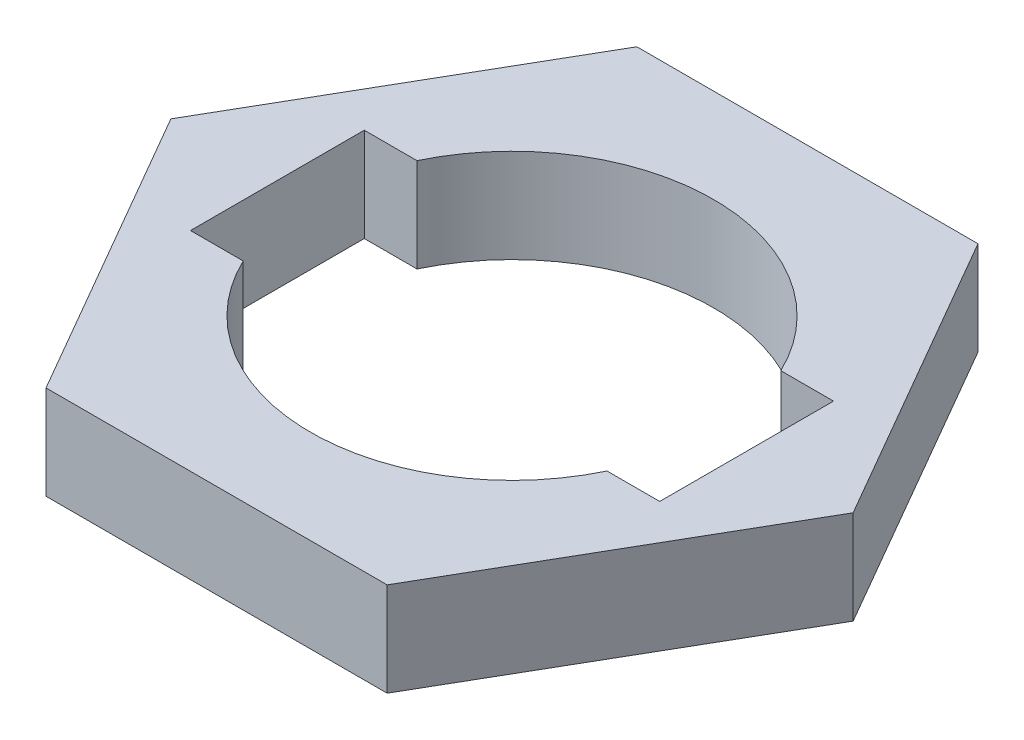
ISO-10303-21;
HEADER;
FILE_DESCRIPTION(('STEP AP214'),'2;1');
FILE_NAME('part.step','',(''),(''),'','','');
FILE_SCHEMA(('AUTOMOTIVE_DESIGN { 1 0 10303 214 1 1 1 1 }'));
ENDSEC;
DATA;
#1=APPLICATION_CONTEXT('core data for automotive mechanical design processes');
#2=APPLICATION_PROTOCOL_DEFINITION('international standard','automotive_design',2000,#1);
#3=PRODUCT_CONTEXT('',#1,'mechanical');
#4=PRODUCT('Part','Part','',(#3));
#5=PRODUCT_RELATED_PRODUCT_CATEGORY('part','',(#4));
#6=PRODUCT_DEFINITION_FORMATION('','',#4);
#7=PRODUCT_DEFINITION_CONTEXT('part definition',#1,'design');
#8=PRODUCT_DEFINITION('design','',#6,#7);
#9=PRODUCT_DEFINITION_SHAPE('','',#8);
#10=(LENGTH_UNIT() NAMED_UNIT(*) SI_UNIT(.MILLI.,.METRE.));
#11=(NAMED_UNIT(*) PLANE_ANGLE_UNIT() SI_UNIT($,.RADIAN.));
#12=(NAMED_UNIT(*) SI_UNIT($,.STERADIAN.) SOLID_ANGLE_UNIT());
#13=UNCERTAINTY_MEASURE_WITH_UNIT(LENGTH_MEASURE(1.E-05),#10,'distance_accuracy_value','');
#14=(GEOMETRIC_REPRESENTATION_CONTEXT(3) GLOBAL_UNCERTAINTY_ASSIGNED_CONTEXT((#13)) GLOBAL_UNIT_ASSIGNED_CONTEXT((#10,
#11,#12)) REPRESENTATION_CONTEXT('',''));
#15=CARTESIAN_POINT('',(0.,0.,0.));
#16=DIRECTION('',(0.,0.,1.));
#17=DIRECTION('',(1.,0.,0.));
#18=AXIS2_PLACEMENT_3D('',#15,#16,#17);
#19=CARTESIAN_POINT('',(6.75,2.7,2.5));
#20=DIRECTION('',(0.,0.,-1.));
#21=DIRECTION('',(-1.,0.,0.));
#22=AXIS2_PLACEMENT_3D('',#19,#20,#21);
#23=PLANE('',#22);
#24=DIRECTION('',(-1.,0.,0.));
#25=VECTOR('',#24,1.);
#26=CARTESIAN_POINT('',(6.75,2.7,2.5));
#27=LINE('',#26,#25);
#28=CARTESIAN_POINT('',(-6.75,2.7,2.5));
#29=VERTEX_POINT('',#28);
#30=CARTESIAN_POINT('',(-5.23354564325181,2.7,2.5));
#31=VERTEX_POINT('',#30);
#32=EDGE_CURVE('E212',#29,#31,#27,.F.);
#33=ORIENTED_EDGE('',*,*,#32,.T.);
#34=DIRECTION('',(0.,-1.,0.));
#35=VECTOR('',#34,1.);
#36=CARTESIAN_POINT('',(-5.23354564325181,2.7,2.5));
#37=LINE('',#36,#35);
#38=CARTESIAN_POINT('',(-5.23354564325181,0.,2.5));
#39=VERTEX_POINT('',#38);
#40=EDGE_CURVE('E78',#31,#39,#37,.T.);
#41=ORIENTED_EDGE('',*,*,#40,.T.);
#42=DIRECTION('',(1.,0.,0.));
#43=VECTOR('',#42,1.);
#44=CARTESIAN_POINT('',(0.,0.,2.5));
#45=LINE('',#44,#43);
#46=CARTESIAN_POINT('',(-6.75,0.,2.5));
#47=VERTEX_POINT('',#46);
#48=EDGE_CURVE('E202',#39,#47,#45,.F.);
#49=ORIENTED_EDGE('',*,*,#48,.T.);
#50=DIRECTION('',(0.,1.,0.));
#51=VECTOR('',#50,1.);
#52=CARTESIAN_POINT('',(-6.75,2.7,2.5));
#53=LINE('',#52,#51);
#54=EDGE_CURVE('E175',#29,#47,#53,.F.);
#55=ORIENTED_EDGE('',*,*,#54,.F.);
#56=EDGE_LOOP('',(#33,#41,#49,#55));
#57=FACE_BOUND('',#56,.T.);
#58=ADVANCED_FACE('F17',(#57),#23,.T.);
#59=CARTESIAN_POINT('',(6.75,2.7,-2.5));
#60=DIRECTION('',(0.,0.,1.));
#61=DIRECTION('',(1.,0.,0.));
#62=AXIS2_PLACEMENT_3D('',#59,#60,#61);
#63=PLANE('',#62);
#64=DIRECTION('',(1.,0.,0.));
#65=VECTOR('',#64,1.);
#66=CARTESIAN_POINT('',(0.,0.,-2.5));
#67=LINE('',#66,#65);
#68=CARTESIAN_POINT('',(-6.75,0.,-2.5));
#69=VERTEX_POINT('',#68);
#70=CARTESIAN_POINT('',(-5.23354564325181,0.,-2.5));
#71=VERTEX_POINT('',#70);
#72=EDGE_CURVE('E204',#69,#71,#67,.T.);
#73=ORIENTED_EDGE('',*,*,#72,.T.);
#74=DIRECTION('',(0.,-1.,0.));
#75=VECTOR('',#74,1.);
#76=CARTESIAN_POINT('',(-5.23354564325181,2.7,-2.5));
#77=LINE('',#76,#75);
#78=CARTESIAN_POINT('',(-5.23354564325181,2.7,-2.5));
#79=VERTEX_POINT('',#78);
#80=EDGE_CURVE('E168',#71,#79,#77,.F.);
#81=ORIENTED_EDGE('',*,*,#80,.T.);
#82=DIRECTION('',(1.,0.,0.));
#83=VECTOR('',#82,1.);
#84=CARTESIAN_POINT('',(6.75,2.7,-2.5));
#85=LINE('',#84,#83);
#86=CARTESIAN_POINT('',(-6.75,2.7,-2.5));
#87=VERTEX_POINT('',#86);
#88=EDGE_CURVE('E208',#79,#87,#85,.F.);
#89=ORIENTED_EDGE('',*,*,#88,.T.);
#90=DIRECTION('',(0.,1.,0.));
#91=VECTOR('',#90,1.);
#92=CARTESIAN_POINT('',(-6.75,2.7,-2.5));
#93=LINE('',#92,#91);
#94=EDGE_CURVE('E246',#69,#87,#93,.T.);
#95=ORIENTED_EDGE('',*,*,#94,.F.);
#96=EDGE_LOOP('',(#73,#81,#89,#95));
#97=FACE_BOUND('',#96,.T.);
#98=ADVANCED_FACE('F276',(#97),#63,.T.);
#99=CARTESIAN_POINT('',(0.,0.,0.));
#100=DIRECTION('',(0.,1.,0.));
#101=DIRECTION('',(0.,0.,1.));
#102=AXIS2_PLACEMENT_3D('',#99,#100,#101);
#103=PLANE('',#102);
#104=CARTESIAN_POINT('',(0.,0.,0.));
#105=DIRECTION('',(0.,-1.,0.));
#106=DIRECTION('',(0.,0.,-1.));
#107=AXIS2_PLACEMENT_3D('',#104,#105,#106);
#108=CIRCLE('',#107,5.8);
#109=CARTESIAN_POINT('',(5.23354564325181,0.,2.5));
#110=VERTEX_POINT('',#109);
#111=EDGE_CURVE('E20',#39,#110,#108,.F.);
#112=ORIENTED_EDGE('',*,*,#111,.T.);
#113=DIRECTION('',(-1.,0.,0.));
#114=VECTOR('',#113,1.);
#115=CARTESIAN_POINT('',(6.75,0.,2.5));
#116=LINE('',#115,#114);
#117=CARTESIAN_POINT('',(6.75,0.,2.5));
#118=VERTEX_POINT('',#117);
#119=EDGE_CURVE('E114',#118,#110,#116,.T.);
#120=ORIENTED_EDGE('',*,*,#119,.F.);
#121=DIRECTION('',(0.,0.,1.));
#122=VECTOR('',#121,1.);
#123=CARTESIAN_POINT('',(6.75,0.,2.5));
#124=LINE('',#123,#122);
#125=CARTESIAN_POINT('',(6.75,0.,-2.5));
#126=VERTEX_POINT('',#125);
#127=EDGE_CURVE('E110',#126,#118,#124,.T.);
#128=ORIENTED_EDGE('',*,*,#127,.F.);
#129=DIRECTION('',(1.,0.,0.));
#130=VECTOR('',#129,1.);
#131=CARTESIAN_POINT('',(6.75,0.,-2.5));
#132=LINE('',#131,#130);
#133=CARTESIAN_POINT('',(5.23354564325181,0.,-2.5));
#134=VERTEX_POINT('',#133);
#135=EDGE_CURVE('E216',#134,#126,#132,.T.);
#136=ORIENTED_EDGE('',*,*,#135,.F.);
#137=CARTESIAN_POINT('',(0.,0.,0.));
#138=DIRECTION('',(0.,-1.,0.));
#139=DIRECTION('',(0.,0.,-1.));
#140=AXIS2_PLACEMENT_3D('',#137,#138,#139);
#141=CIRCLE('',#140,5.8);
#142=EDGE_CURVE('E171',#134,#71,#141,.F.);
#143=ORIENTED_EDGE('',*,*,#142,.T.);
#144=ORIENTED_EDGE('',*,*,#72,.F.);
#145=DIRECTION('',(0.,0.,-1.));
#146=VECTOR('',#145,1.);
#147=CARTESIAN_POINT('',(-6.75,0.,2.5));
#148=LINE('',#147,#146);
#149=EDGE_CURVE('E178',#47,#69,#148,.T.);
#150=ORIENTED_EDGE('',*,*,#149,.F.);
#151=ORIENTED_EDGE('',*,*,#48,.F.);
#152=EDGE_LOOP('',(#112,#120,#128,#136,#143,#144,#150,#151));
#153=FACE_BOUND('',#152,.T.);
#154=DIRECTION('',(-0.5,0.,-0.866025403784439));
#155=VECTOR('',#154,1.);
#156=CARTESIAN_POINT('',(-9.81495457622364,0.,0.));
#157=LINE('',#156,#155);
#158=CARTESIAN_POINT('',(-4.90747728811182,0.,8.5));
#159=VERTEX_POINT('',#158);
#160=CARTESIAN_POINT('',(-9.81495457622364,0.,0.));
#161=VERTEX_POINT('',#160);
#162=EDGE_CURVE('E180',#159,#161,#157,.T.);
#163=ORIENTED_EDGE('',*,*,#162,.T.);
#164=DIRECTION('',(0.5,0.,-0.866025403784439));
#165=VECTOR('',#164,1.);
#166=CARTESIAN_POINT('',(-4.90747728811182,0.,-8.5));
#167=LINE('',#166,#165);
#168=CARTESIAN_POINT('',(-4.90747728811182,0.,-8.50000000000001));
#169=VERTEX_POINT('',#168);
#170=EDGE_CURVE('E143',#161,#169,#167,.T.);
#171=ORIENTED_EDGE('',*,*,#170,.T.);
#172=DIRECTION('',(1.,0.,0.));
#173=VECTOR('',#172,1.);
#174=CARTESIAN_POINT('',(4.90747728811181,0.,-8.50000000000001));
#175=LINE('',#174,#173);
#176=CARTESIAN_POINT('',(4.90747728811181,0.,-8.50000000000001));
#177=VERTEX_POINT('',#176);
#178=EDGE_CURVE('E186',#169,#177,#175,.T.);
#179=ORIENTED_EDGE('',*,*,#178,.T.);
#180=DIRECTION('',(0.5,0.,0.866025403784439));
#181=VECTOR('',#180,1.);
#182=CARTESIAN_POINT('',(9.81495457622364,0.,0.));
#183=LINE('',#182,#181);
#184=CARTESIAN_POINT('',(9.81495457622364,0.,0.));
#185=VERTEX_POINT('',#184);
#186=EDGE_CURVE('E191',#177,#185,#183,.T.);
#187=ORIENTED_EDGE('',*,*,#186,.T.);
#188=DIRECTION('',(-0.5,0.,0.866025403784439));
#189=VECTOR('',#188,1.);
#190=CARTESIAN_POINT('',(4.90747728811182,0.,8.5));
#191=LINE('',#190,#189);
#192=CARTESIAN_POINT('',(4.90747728811182,0.,8.5));
#193=VERTEX_POINT('',#192);
#194=EDGE_CURVE('E196',#185,#193,#191,.T.);
#195=ORIENTED_EDGE('',*,*,#194,.T.);
#196=DIRECTION('',(-1.,0.,0.));
#197=VECTOR('',#196,1.);
#198=CARTESIAN_POINT('',(-4.90747728811182,0.,8.5));
#199=LINE('',#198,#197);
#200=EDGE_CURVE('E88',#193,#159,#199,.T.);
#201=ORIENTED_EDGE('',*,*,#200,.T.);
#202=EDGE_LOOP('',(#163,#171,#179,#187,#195,#201));
#203=FACE_BOUND('',#202,.T.);
#204=ADVANCED_FACE('F268',(#153,#203),#103,.F.);
#205=CARTESIAN_POINT('',(6.75,2.7,2.5));
#206=DIRECTION('',(0.,0.,-1.));
#207=DIRECTION('',(-1.,0.,0.));
#208=AXIS2_PLACEMENT_3D('',#205,#206,#207);
#209=PLANE('',#208);
#210=ORIENTED_EDGE('',*,*,#119,.T.);
#211=DIRECTION('',(0.,-1.,0.));
#212=VECTOR('',#211,1.);
#213=CARTESIAN_POINT('',(5.23354564325181,2.7,2.5));
#214=LINE('',#213,#212);
#215=CARTESIAN_POINT('',(5.23354564325181,2.7,2.5));
#216=VERTEX_POINT('',#215);
#217=EDGE_CURVE('E176',#110,#216,#214,.F.);
#218=ORIENTED_EDGE('',*,*,#217,.T.);
#219=DIRECTION('',(-1.,0.,0.));
#220=VECTOR('',#219,1.);
#221=CARTESIAN_POINT('',(6.75,2.7,2.5));
#222=LINE('',#221,#220);
#223=CARTESIAN_POINT('',(6.75,2.7,2.5));
#224=VERTEX_POINT('',#223);
#225=EDGE_CURVE('E35',#216,#224,#222,.F.);
#226=ORIENTED_EDGE('',*,*,#225,.T.);
#227=DIRECTION('',(0.,1.,0.));
#228=VECTOR('',#227,1.);
#229=CARTESIAN_POINT('',(6.75,2.7,2.5));
#230=LINE('',#229,#228);
#231=EDGE_CURVE('E233',#118,#224,#230,.T.);
#232=ORIENTED_EDGE('',*,*,#231,.F.);
#233=EDGE_LOOP('',(#210,#218,#226,#232));
#234=FACE_BOUND('',#233,.T.);
#235=ADVANCED_FACE('F286',(#234),#209,.T.);
#236=CARTESIAN_POINT('',(6.75,2.7,-2.5));
#237=DIRECTION('',(0.,0.,1.));
#238=DIRECTION('',(1.,0.,0.));
#239=AXIS2_PLACEMENT_3D('',#236,#237,#238);
#240=PLANE('',#239);
#241=DIRECTION('',(1.,0.,0.));
#242=VECTOR('',#241,1.);
#243=CARTESIAN_POINT('',(6.75,2.7,-2.5));
#244=LINE('',#243,#242);
#245=CARTESIAN_POINT('',(6.75,2.7,-2.5));
#246=VERTEX_POINT('',#245);
#247=CARTESIAN_POINT('',(5.23354564325181,2.7,-2.5));
#248=VERTEX_POINT('',#247);
#249=EDGE_CURVE('E201',#246,#248,#244,.F.);
#250=ORIENTED_EDGE('',*,*,#249,.T.);
#251=DIRECTION('',(0.,-1.,0.));
#252=VECTOR('',#251,1.);
#253=CARTESIAN_POINT('',(5.23354564325181,2.7,-2.5));
#254=LINE('',#253,#252);
#255=EDGE_CURVE('E172',#248,#134,#254,.T.);
#256=ORIENTED_EDGE('',*,*,#255,.T.);
#257=ORIENTED_EDGE('',*,*,#135,.T.);
#258=DIRECTION('',(0.,1.,0.));
#259=VECTOR('',#258,1.);
#260=CARTESIAN_POINT('',(6.75,2.7,-2.5));
#261=LINE('',#260,#259);
#262=EDGE_CURVE('E167',#246,#126,#261,.F.);
#263=ORIENTED_EDGE('',*,*,#262,.F.);
#264=EDGE_LOOP('',(#250,#256,#257,#263));
#265=FACE_BOUND('',#264,.T.);
#266=ADVANCED_FACE('F292',(#265),#240,.T.);
#267=CARTESIAN_POINT('',(-4.90747728811182,2.7,8.5));
#268=DIRECTION('',(0.,0.,-1.));
#269=DIRECTION('',(-1.,0.,0.));
#270=AXIS2_PLACEMENT_3D('',#267,#268,#269);
#271=PLANE('',#270);
#272=DIRECTION('',(0.,1.,0.));
#273=VECTOR('',#272,1.);
#274=CARTESIAN_POINT('',(4.90747728811182,2.7,8.5));
#275=LINE('',#274,#273);
#276=CARTESIAN_POINT('',(4.90747728811182,2.7,8.5));
#277=VERTEX_POINT('',#276);
#278=EDGE_CURVE('E198',#193,#277,#275,.T.);
#279=ORIENTED_EDGE('',*,*,#278,.T.);
#280=DIRECTION('',(1.,0.,0.));
#281=VECTOR('',#280,1.);
#282=CARTESIAN_POINT('',(0.,2.7,8.5));
#283=LINE('',#282,#281);
#284=CARTESIAN_POINT('',(-4.90747728811182,2.7,8.5));
#285=VERTEX_POINT('',#284);
#286=EDGE_CURVE('E119',#285,#277,#283,.T.);
#287=ORIENTED_EDGE('',*,*,#286,.F.);
#288=DIRECTION('',(0.,1.,0.));
#289=VECTOR('',#288,1.);
#290=CARTESIAN_POINT('',(-4.90747728811182,2.7,8.5));
#291=LINE('',#290,#289);
#292=EDGE_CURVE('E146',#285,#159,#291,.F.);
#293=ORIENTED_EDGE('',*,*,#292,.T.);
#294=ORIENTED_EDGE('',*,*,#200,.F.);
#295=EDGE_LOOP('',(#279,#287,#293,#294));
#296=FACE_BOUND('',#295,.T.);
#297=ADVANCED_FACE('F327',(#296),#271,.F.);
#298=CARTESIAN_POINT('',(4.90747728811182,2.7,8.5));
#299=DIRECTION('',(-0.866025403784439,0.,-0.5));
#300=DIRECTION('',(-0.5,0.,0.866025403784439));
#301=AXIS2_PLACEMENT_3D('',#298,#299,#300);
#302=PLANE('',#301);
#303=DIRECTION('',(0.,1.,0.));
#304=VECTOR('',#303,1.);
#305=CARTESIAN_POINT('',(9.81495457622364,2.7,0.));
#306=LINE('',#305,#304);
#307=CARTESIAN_POINT('',(9.81495457622364,2.7,0.));
#308=VERTEX_POINT('',#307);
#309=EDGE_CURVE('E194',#185,#308,#306,.T.);
#310=ORIENTED_EDGE('',*,*,#309,.T.);
#311=DIRECTION('',(0.5,0.,-0.866025403784439));
#312=VECTOR('',#311,1.);
#313=CARTESIAN_POINT('',(4.90747728811182,2.7,8.5));
#314=LINE('',#313,#312);
#315=EDGE_CURVE('E163',#277,#308,#314,.T.);
#316=ORIENTED_EDGE('',*,*,#315,.F.);
#317=ORIENTED_EDGE('',*,*,#278,.F.);
#318=ORIENTED_EDGE('',*,*,#194,.F.);
#319=EDGE_LOOP('',(#310,#316,#317,#318));
#320=FACE_BOUND('',#319,.T.);
#321=ADVANCED_FACE('F323',(#320),#302,.F.);
#322=CARTESIAN_POINT('',(9.81495457622364,2.7,0.));
#323=DIRECTION('',(-0.866025403784439,0.,0.5));
#324=DIRECTION('',(0.5,0.,0.866025403784439));
#325=AXIS2_PLACEMENT_3D('',#322,#323,#324);
#326=PLANE('',#325);
#327=DIRECTION('',(0.,1.,0.));
#328=VECTOR('',#327,1.);
#329=CARTESIAN_POINT('',(4.90747728811181,2.7,-8.50000000000001));
#330=LINE('',#329,#328);
#331=CARTESIAN_POINT('',(4.90747728811181,2.7,-8.50000000000001));
#332=VERTEX_POINT('',#331);
#333=EDGE_CURVE('E189',#177,#332,#330,.T.);
#334=ORIENTED_EDGE('',*,*,#333,.T.);
#335=DIRECTION('',(-0.500000000000001,0.,-0.866025403784438));
#336=VECTOR('',#335,1.);
#337=CARTESIAN_POINT('',(9.81495457622364,2.7,0.));
#338=LINE('',#337,#336);
#339=EDGE_CURVE('E159',#308,#332,#338,.T.);
#340=ORIENTED_EDGE('',*,*,#339,.F.);
#341=ORIENTED_EDGE('',*,*,#309,.F.);
#342=ORIENTED_EDGE('',*,*,#186,.F.);
#343=EDGE_LOOP('',(#334,#340,#341,#342));
#344=FACE_BOUND('',#343,.T.);
#345=ADVANCED_FACE('F319',(#344),#326,.F.);
#346=CARTESIAN_POINT('',(4.90747728811181,2.7,-8.50000000000001));
#347=DIRECTION('',(0.,0.,1.));
#348=DIRECTION('',(1.,0.,0.));
#349=AXIS2_PLACEMENT_3D('',#346,#347,#348);
#350=PLANE('',#349);
#351=DIRECTION('',(0.,1.,0.));
#352=VECTOR('',#351,1.);
#353=CARTESIAN_POINT('',(-4.90747728811182,2.7,-8.5));
#354=LINE('',#353,#352);
#355=CARTESIAN_POINT('',(-4.90747728811182,2.7,-8.50000000000001));
#356=VERTEX_POINT('',#355);
#357=EDGE_CURVE('E184',#169,#356,#354,.T.);
#358=ORIENTED_EDGE('',*,*,#357,.T.);
#359=DIRECTION('',(1.,0.,0.));
#360=VECTOR('',#359,1.);
#361=CARTESIAN_POINT('',(0.,2.7,-8.50000000000001));
#362=LINE('',#361,#360);
#363=EDGE_CURVE('E157',#332,#356,#362,.F.);
#364=ORIENTED_EDGE('',*,*,#363,.F.);
#365=ORIENTED_EDGE('',*,*,#333,.F.);
#366=ORIENTED_EDGE('',*,*,#178,.F.);
#367=EDGE_LOOP('',(#358,#364,#365,#366));
#368=FACE_BOUND('',#367,.T.);
#369=ADVANCED_FACE('F316',(#368),#350,.F.);
#370=CARTESIAN_POINT('',(-4.90747728811182,2.7,-8.5));
#371=DIRECTION('',(0.866025403784439,0.,0.5));
#372=DIRECTION('',(0.5,0.,-0.866025403784439));
#373=AXIS2_PLACEMENT_3D('',#370,#371,#372);
#374=PLANE('',#373);
#375=DIRECTION('',(0.,1.,0.));
#376=VECTOR('',#375,1.);
#377=CARTESIAN_POINT('',(-9.81495457622364,2.7,0.));
#378=LINE('',#377,#376);
#379=CARTESIAN_POINT('',(-9.81495457622364,2.7,0.));
#380=VERTEX_POINT('',#379);
#381=EDGE_CURVE('E135',#161,#380,#378,.T.);
#382=ORIENTED_EDGE('',*,*,#381,.T.);
#383=DIRECTION('',(-0.5,0.,0.866025403784439));
#384=VECTOR('',#383,1.);
#385=CARTESIAN_POINT('',(-4.90747728811182,2.7,-8.5));
#386=LINE('',#385,#384);
#387=EDGE_CURVE('E140',#356,#380,#386,.T.);
#388=ORIENTED_EDGE('',*,*,#387,.F.);
#389=ORIENTED_EDGE('',*,*,#357,.F.);
#390=ORIENTED_EDGE('',*,*,#170,.F.);
#391=EDGE_LOOP('',(#382,#388,#389,#390));
#392=FACE_BOUND('',#391,.T.);
#393=ADVANCED_FACE('F137',(#392),#374,.F.);
#394=CARTESIAN_POINT('',(-9.81495457622364,2.7,0.));
#395=DIRECTION('',(0.866025403784439,0.,-0.5));
#396=DIRECTION('',(-0.5,0.,-0.866025403784439));
#397=AXIS2_PLACEMENT_3D('',#394,#395,#396);
#398=PLANE('',#397);
#399=ORIENTED_EDGE('',*,*,#292,.F.);
#400=DIRECTION('',(0.5,0.,0.866025403784439));
#401=VECTOR('',#400,1.);
#402=CARTESIAN_POINT('',(-9.81495457622364,2.7,0.));
#403=LINE('',#402,#401);
#404=EDGE_CURVE('E149',#380,#285,#403,.T.);
#405=ORIENTED_EDGE('',*,*,#404,.F.);
#406=ORIENTED_EDGE('',*,*,#381,.F.);
#407=ORIENTED_EDGE('',*,*,#162,.F.);
#408=EDGE_LOOP('',(#399,#405,#406,#407));
#409=FACE_BOUND('',#408,.T.);
#410=ADVANCED_FACE('F150',(#409),#398,.F.);
#411=CARTESIAN_POINT('',(0.,2.7,0.));
#412=DIRECTION('',(0.,-1.,0.));
#413=DIRECTION('',(0.,0.,-1.));
#414=AXIS2_PLACEMENT_3D('',#411,#412,#413);
#415=CYLINDRICAL_SURFACE('',#414,5.8);
#416=ORIENTED_EDGE('',*,*,#217,.F.);
#417=ORIENTED_EDGE('',*,*,#111,.F.);
#418=ORIENTED_EDGE('',*,*,#40,.F.);
#419=CARTESIAN_POINT('',(0.,2.7,0.));
#420=DIRECTION('',(0.,-1.,0.));
#421=DIRECTION('',(0.,0.,-1.));
#422=AXIS2_PLACEMENT_3D('',#419,#420,#421);
#423=CIRCLE('',#422,5.8);
#424=EDGE_CURVE('E152',#216,#31,#423,.T.);
#425=ORIENTED_EDGE('',*,*,#424,.F.);
#426=EDGE_LOOP('',(#416,#417,#418,#425));
#427=FACE_BOUND('',#426,.T.);
#428=ADVANCED_FACE('F284',(#427),#415,.F.);
#429=CARTESIAN_POINT('',(-6.75,2.7,2.5));
#430=DIRECTION('',(1.,0.,0.));
#431=DIRECTION('',(0.,0.,-1.));
#432=AXIS2_PLACEMENT_3D('',#429,#430,#431);
#433=PLANE('',#432);
#434=DIRECTION('',(0.,0.,1.));
#435=VECTOR('',#434,1.);
#436=CARTESIAN_POINT('',(-6.75,2.7,0.));
#437=LINE('',#436,#435);
#438=EDGE_CURVE('E257',#29,#87,#437,.F.);
#439=ORIENTED_EDGE('',*,*,#438,.F.);
#440=ORIENTED_EDGE('',*,*,#54,.T.);
#441=ORIENTED_EDGE('',*,*,#149,.T.);
#442=ORIENTED_EDGE('',*,*,#94,.T.);
#443=EDGE_LOOP('',(#439,#440,#441,#442));
#444=FACE_BOUND('',#443,.T.);
#445=ADVANCED_FACE('F279',(#444),#433,.T.);
#446=CARTESIAN_POINT('',(0.,2.7,0.));
#447=DIRECTION('',(0.,-1.,0.));
#448=DIRECTION('',(0.,0.,-1.));
#449=AXIS2_PLACEMENT_3D('',#446,#447,#448);
#450=CYLINDRICAL_SURFACE('',#449,5.8);
#451=ORIENTED_EDGE('',*,*,#80,.F.);
#452=ORIENTED_EDGE('',*,*,#142,.F.);
#453=ORIENTED_EDGE('',*,*,#255,.F.);
#454=CARTESIAN_POINT('',(0.,2.7,0.));
#455=DIRECTION('',(0.,-1.,0.));
#456=DIRECTION('',(0.,0.,-1.));
#457=AXIS2_PLACEMENT_3D('',#454,#455,#456);
#458=CIRCLE('',#457,5.8);
#459=EDGE_CURVE('E26',#79,#248,#458,.T.);
#460=ORIENTED_EDGE('',*,*,#459,.F.);
#461=EDGE_LOOP('',(#451,#452,#453,#460));
#462=FACE_BOUND('',#461,.T.);
#463=ADVANCED_FACE('F274',(#462),#450,.F.);
#464=CARTESIAN_POINT('',(6.75,2.7,2.5));
#465=DIRECTION('',(-1.,0.,0.));
#466=DIRECTION('',(0.,0.,1.));
#467=AXIS2_PLACEMENT_3D('',#464,#465,#466);
#468=PLANE('',#467);
#469=DIRECTION('',(0.,0.,1.));
#470=VECTOR('',#469,1.);
#471=CARTESIAN_POINT('',(6.75,2.7,0.));
#472=LINE('',#471,#470);
#473=EDGE_CURVE('E11',#246,#224,#472,.T.);
#474=ORIENTED_EDGE('',*,*,#473,.F.);
#475=ORIENTED_EDGE('',*,*,#262,.T.);
#476=ORIENTED_EDGE('',*,*,#127,.T.);
#477=ORIENTED_EDGE('',*,*,#231,.T.);
#478=EDGE_LOOP('',(#474,#475,#476,#477));
#479=FACE_BOUND('',#478,.T.);
#480=ADVANCED_FACE('F289',(#479),#468,.T.);
#481=CARTESIAN_POINT('',(0.,2.7,0.));
#482=DIRECTION('',(0.,1.,0.));
#483=DIRECTION('',(0.,0.,1.));
#484=AXIS2_PLACEMENT_3D('',#481,#482,#483);
#485=PLANE('',#484);
#486=ORIENTED_EDGE('',*,*,#473,.T.);
#487=ORIENTED_EDGE('',*,*,#225,.F.);
#488=ORIENTED_EDGE('',*,*,#424,.T.);
#489=ORIENTED_EDGE('',*,*,#32,.F.);
#490=ORIENTED_EDGE('',*,*,#438,.T.);
#491=ORIENTED_EDGE('',*,*,#88,.F.);
#492=ORIENTED_EDGE('',*,*,#459,.T.);
#493=ORIENTED_EDGE('',*,*,#249,.F.);
#494=EDGE_LOOP('',(#486,#487,#488,#489,#490,#491,#492,#493));
#495=FACE_BOUND('',#494,.T.);
#496=ORIENTED_EDGE('',*,*,#387,.T.);
#497=ORIENTED_EDGE('',*,*,#404,.T.);
#498=ORIENTED_EDGE('',*,*,#286,.T.);
#499=ORIENTED_EDGE('',*,*,#315,.T.);
#500=ORIENTED_EDGE('',*,*,#339,.T.);
#501=ORIENTED_EDGE('',*,*,#363,.T.);
#502=EDGE_LOOP('',(#496,#497,#498,#499,#500,#501));
#503=FACE_BOUND('',#502,.T.);
#504=ADVANCED_FACE('F154',(#495,#503),#485,.T.);
#505=CLOSED_SHELL('',(#58,#98,#204,#235,#266,#297,#321,#345,#369,#393,#410,#428,#445,#463,#480,#504));
#506=MANIFOLD_SOLID_BREP('B1',#505);
#507=ADVANCED_BREP_SHAPE_REPRESENTATION('',(#18,#506),#14);
#508=SHAPE_DEFINITION_REPRESENTATION(#9,#507);
ENDSEC;
END-ISO-10303-21;
